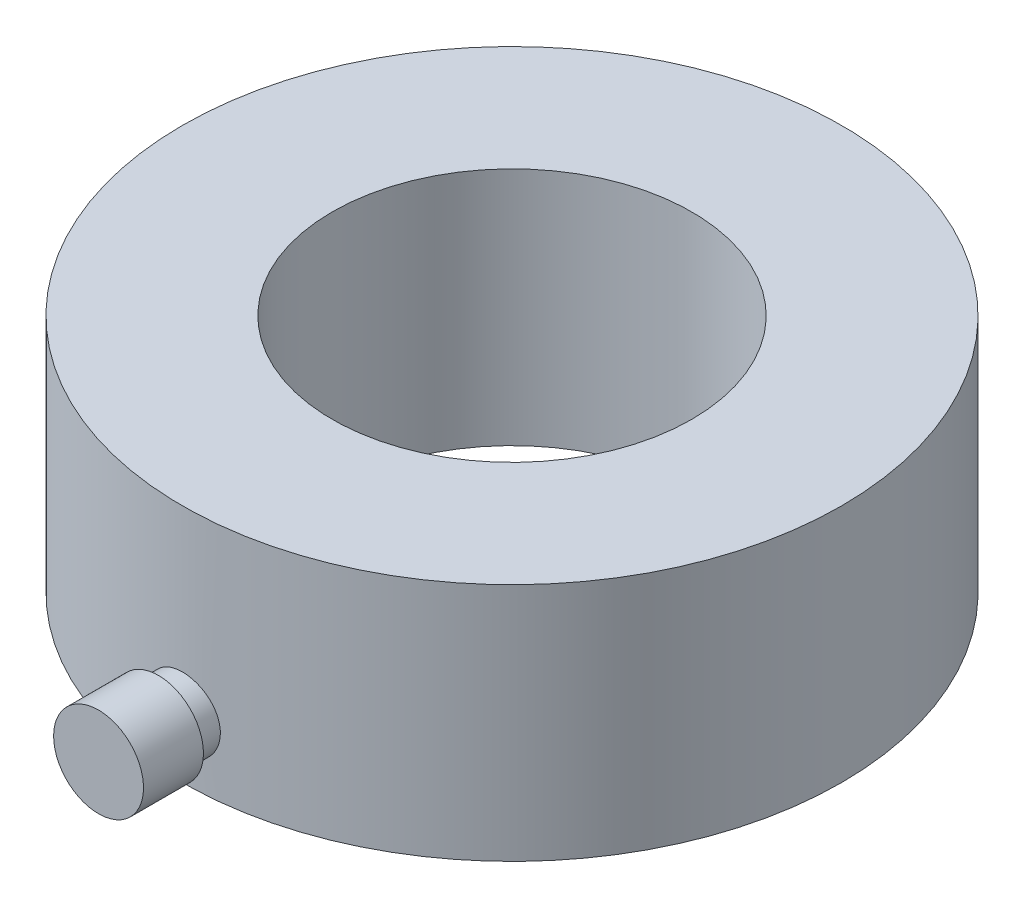
ISO-10303-21;
HEADER;
FILE_DESCRIPTION(('STEP AP214'),'2;1');
FILE_NAME('part.step','',(''),(''),'','','');
FILE_SCHEMA(('AUTOMOTIVE_DESIGN { 1 0 10303 214 1 1 1 1 }'));
ENDSEC;
DATA;
#1=APPLICATION_CONTEXT('core data for automotive mechanical design processes');
#2=APPLICATION_PROTOCOL_DEFINITION('international standard','automotive_design',2000,#1);
#3=PRODUCT_CONTEXT('',#1,'mechanical');
#4=PRODUCT('Part','Part','',(#3));
#5=PRODUCT_RELATED_PRODUCT_CATEGORY('part','',(#4));
#6=PRODUCT_DEFINITION_FORMATION('','',#4);
#7=PRODUCT_DEFINITION_CONTEXT('part definition',#1,'design');
#8=PRODUCT_DEFINITION('design','',#6,#7);
#9=PRODUCT_DEFINITION_SHAPE('','',#8);
#10=(LENGTH_UNIT() NAMED_UNIT(*) SI_UNIT(.MILLI.,.METRE.));
#11=(NAMED_UNIT(*) PLANE_ANGLE_UNIT() SI_UNIT($,.RADIAN.));
#12=(NAMED_UNIT(*) SI_UNIT($,.STERADIAN.) SOLID_ANGLE_UNIT());
#13=UNCERTAINTY_MEASURE_WITH_UNIT(LENGTH_MEASURE(1.E-05),#10,'distance_accuracy_value','');
#14=(GEOMETRIC_REPRESENTATION_CONTEXT(3) GLOBAL_UNCERTAINTY_ASSIGNED_CONTEXT((#13)) GLOBAL_UNIT_ASSIGNED_CONTEXT((#10,
#11,#12)) REPRESENTATION_CONTEXT('',''));
#15=CARTESIAN_POINT('',(0.,0.,0.));
#16=DIRECTION('',(0.,0.,1.));
#17=DIRECTION('',(1.,0.,0.));
#18=AXIS2_PLACEMENT_3D('',#15,#16,#17);
#19=CARTESIAN_POINT('',(0.,0.,0.));
#20=DIRECTION('',(0.,1.,0.));
#21=DIRECTION('',(1.,0.,0.));
#22=AXIS2_PLACEMENT_3D('',#19,#20,#21);
#23=PLANE('',#22);
#24=CARTESIAN_POINT('',(0.,0.,0.));
#25=DIRECTION('',(0.,1.,0.));
#26=DIRECTION('',(1.,0.,0.));
#27=AXIS2_PLACEMENT_3D('',#24,#25,#26);
#28=CIRCLE('',#27,30.);
#29=CARTESIAN_POINT('',(-30.,0.,0.));
#30=VERTEX_POINT('',#29);
#31=EDGE_CURVE('E92',#30,#30,#28,.T.);
#32=ORIENTED_EDGE('',*,*,#31,.T.);
#33=EDGE_LOOP('',(#32));
#34=FACE_BOUND('',#33,.T.);
#35=CARTESIAN_POINT('',(0.,0.,0.));
#36=DIRECTION('',(0.,1.,0.));
#37=DIRECTION('',(-1.,0.,0.));
#38=AXIS2_PLACEMENT_3D('',#35,#36,#37);
#39=CIRCLE('',#38,55.);
#40=CARTESIAN_POINT('',(55.,0.,0.));
#41=VERTEX_POINT('',#40);
#42=EDGE_CURVE('E10',#41,#41,#39,.T.);
#43=ORIENTED_EDGE('',*,*,#42,.F.);
#44=EDGE_LOOP('',(#43));
#45=FACE_BOUND('',#44,.T.);
#46=ADVANCED_FACE('F16',(#34,#45),#23,.F.);
#47=CARTESIAN_POINT('',(0.,40.,0.));
#48=DIRECTION('',(0.,1.,0.));
#49=DIRECTION('',(1.,0.,0.));
#50=AXIS2_PLACEMENT_3D('',#47,#48,#49);
#51=PLANE('',#50);
#52=CARTESIAN_POINT('',(0.,40.,0.));
#53=DIRECTION('',(0.,-1.,0.));
#54=DIRECTION('',(1.,0.,0.));
#55=AXIS2_PLACEMENT_3D('',#52,#53,#54);
#56=CIRCLE('',#55,30.);
#57=CARTESIAN_POINT('',(-30.,40.,0.));
#58=VERTEX_POINT('',#57);
#59=EDGE_CURVE('E102',#58,#58,#56,.T.);
#60=ORIENTED_EDGE('',*,*,#59,.T.);
#61=EDGE_LOOP('',(#60));
#62=FACE_BOUND('',#61,.T.);
#63=CARTESIAN_POINT('',(0.,40.,0.));
#64=DIRECTION('',(0.,1.,0.));
#65=DIRECTION('',(-1.,0.,0.));
#66=AXIS2_PLACEMENT_3D('',#63,#64,#65);
#67=CIRCLE('',#66,55.);
#68=CARTESIAN_POINT('',(55.,40.,0.));
#69=VERTEX_POINT('',#68);
#70=EDGE_CURVE('E120',#69,#69,#67,.T.);
#71=ORIENTED_EDGE('',*,*,#70,.T.);
#72=EDGE_LOOP('',(#71));
#73=FACE_BOUND('',#72,.T.);
#74=ADVANCED_FACE('F106',(#62,#73),#51,.T.);
#75=CARTESIAN_POINT('',(0.,0.,0.));
#76=DIRECTION('',(0.,1.,0.));
#77=DIRECTION('',(-1.,0.,0.));
#78=AXIS2_PLACEMENT_3D('',#75,#76,#77);
#79=CYLINDRICAL_SURFACE('',#78,55.);
#80=CARTESIAN_POINT('',(-5.99999999999996,10.,54.6717477313466));
#81=CARTESIAN_POINT('',(-6.00000768003073,10.0990131681619,54.6717461806716));
#82=CARTESIAN_POINT('',(-5.99764143410403,10.1980314195202,54.6720065439252));
#83=CARTESIAN_POINT('',(-5.98811538831646,10.3951306054946,54.6730511089026));
#84=CARTESIAN_POINT('',(-5.98098965038959,10.4932132124071,54.6738315882569));
#85=CARTESIAN_POINT('',(-5.96194594034771,10.6884423680346,54.6759113905442));
#86=CARTESIAN_POINT('',(-5.95005067743253,10.785591149657,54.6772082546079));
#87=CARTESIAN_POINT('',(-5.9214810328095,10.9789515205911,54.6803097075683));
#88=CARTESIAN_POINT('',(-5.90481749454763,11.0751647298916,54.6821131443086));
#89=CARTESIAN_POINT('',(-5.86672129408108,11.2666549917009,54.6862135071838));
#90=CARTESIAN_POINT('',(-5.84528752224197,11.3619318209993,54.688510548135));
#91=CARTESIAN_POINT('',(-5.79766132837355,11.5515513092226,54.6935800428972));
#92=CARTESIAN_POINT('',(-5.77145609957133,11.6458907154784,54.6963537750126));
#93=CARTESIAN_POINT('',(-5.71429629777718,11.8336387322592,54.7023550468304));
#94=CARTESIAN_POINT('',(-5.68331781618562,11.9270399855855,54.7055848637932));
#95=CARTESIAN_POINT('',(-5.61662066505169,12.1129155591855,54.7124730168264));
#96=CARTESIAN_POINT('',(-5.58086788679792,12.2053775098389,54.7161344117649));
#97=CARTESIAN_POINT('',(-5.50506739187797,12.3883180473515,54.7238127692947));
#98=CARTESIAN_POINT('',(-5.46502733163503,12.4787998334886,54.7278290958635));
#99=CARTESIAN_POINT('',(-5.3808759611663,12.657071266747,54.7361667286298));
#100=CARTESIAN_POINT('',(-5.33679474716211,12.7448752124278,54.7404857315889));
#101=CARTESIAN_POINT('',(-5.24456969219406,12.9177933090811,54.7493983977165));
#102=CARTESIAN_POINT('',(-5.19644534257738,13.0029179205447,54.7539907151686));
#103=CARTESIAN_POINT('',(-5.09614196308206,13.1704816024455,54.7634172461667));
#104=CARTESIAN_POINT('',(-5.04397186998613,13.2529260515467,54.7682509186066));
#105=CARTESIAN_POINT('',(-4.93558490020864,13.4151347135851,54.7781248620207));
#106=CARTESIAN_POINT('',(-4.87936677418759,13.4948980878282,54.7831651965683));
#107=CARTESIAN_POINT('',(-4.76289117723921,13.6517510729785,54.7934146990503));
#108=CARTESIAN_POINT('',(-4.70262294625374,13.728832663515,54.798624296071));
#109=CARTESIAN_POINT('',(-4.57805341509225,13.8803293628848,54.8091721710482));
#110=CARTESIAN_POINT('',(-4.51373278369709,13.9547285330148,54.8145109770354));
#111=CARTESIAN_POINT('',(-4.38106525515576,14.1008686730933,54.825274539342));
#112=CARTESIAN_POINT('',(-4.31269161460873,14.1725853184158,54.8306996402811));
#113=CARTESIAN_POINT('',(-4.17267572344905,14.3126100875014,54.8415326755442));
#114=CARTESIAN_POINT('',(-4.10103683386074,14.380921571113,54.846940621654));
#115=CARTESIAN_POINT('',(-3.95503165371897,14.5134883360189,54.8576616556827));
#116=CARTESIAN_POINT('',(-3.88068871655826,14.5777692826198,54.8629751462433));
#117=CARTESIAN_POINT('',(-3.72928420150497,14.7022817250662,54.873474187268));
#118=CARTESIAN_POINT('',(-3.65223763613632,14.7625314266967,54.8786602349924));
#119=CARTESIAN_POINT('',(-3.4954330771139,14.8789891238928,54.8888704989002));
#120=CARTESIAN_POINT('',(-3.41568224977827,14.9352067337288,54.8938950831255));
#121=CARTESIAN_POINT('',(-3.25347637561135,15.0436091155887,54.9037475292248));
#122=CARTESIAN_POINT('',(-3.17102139582704,15.0957939874932,54.9085753959697));
#123=CARTESIAN_POINT('',(-3.00341383395254,15.1961406895896,54.9179985724111));
#124=CARTESIAN_POINT('',(-2.91825519163191,15.2442924506385,54.9225932893837));
#125=CARTESIAN_POINT('',(-2.74524576662243,15.3365829303699,54.9315134024857));
#126=CARTESIAN_POINT('',(-2.65738393340013,15.3807010608363,54.9358373848684));
#127=CARTESIAN_POINT('',(-2.47897417652329,15.4649358975808,54.9441782038009));
#128=CARTESIAN_POINT('',(-2.38841145908,15.505021478134,54.9481926024838));
#129=CARTESIAN_POINT('',(-2.20544619029946,15.5808466390607,54.9558404076774));
#130=CARTESIAN_POINT('',(-2.11304325501176,15.6165853011825,54.9594737336675));
#131=CARTESIAN_POINT('',(-1.92726443636923,15.6832622162059,54.9663008337318));
#132=CARTESIAN_POINT('',(-1.8339005626954,15.7142335762601,54.9694976200857));
#133=CARTESIAN_POINT('',(-1.64620857288372,15.7713863527619,54.9754378732029));
#134=CARTESIAN_POINT('',(-1.5518875232941,15.7975907345578,54.978183506886));
#135=CARTESIAN_POINT('',(-1.36228784441143,15.8452197677734,54.9832078174622));
#136=CARTESIAN_POINT('',(-1.26701225119376,15.8666563754482,54.9854876612299));
#137=CARTESIAN_POINT('',(-1.07550968457964,15.9047611882132,54.9895667419415));
#138=CARTESIAN_POINT('',(-0.979282785244852,15.9214297615296,54.9913660159983));
#139=CARTESIAN_POINT('',(-0.785882788543224,15.9500103026571,54.9944703019112));
#140=CARTESIAN_POINT('',(-0.688707979694531,15.9619108096912,54.9957741224861));
#141=CARTESIAN_POINT('',(-0.493416085586033,15.9809668328933,54.9978737982688));
#142=CARTESIAN_POINT('',(-0.395296716123971,15.9880991675149,54.9986671711279));
#143=CARTESIAN_POINT('',(-0.198119378376924,15.9976314701039,54.9997321710602));
#144=CARTESIAN_POINT('',(-0.0990597389834734,15.9999969922851,55.0000000001039));
#145=CARTESIAN_POINT('',(0.099024958842525,16.0000030066589,54.9999999998962));
#146=CARTESIAN_POINT('',(0.198050017205152,15.9976451575308,54.9997323586829));
#147=CARTESIAN_POINT('',(0.395168076654777,15.9881252130502,54.9986680514317));
#148=CARTESIAN_POINT('',(0.49326272552776,15.9809971196636,54.9978751299555));
#149=CARTESIAN_POINT('',(0.68851510091086,15.9619485287984,54.9957765113117));
#150=CARTESIAN_POINT('',(0.785675064103203,15.9500507325695,54.994473243792));
#151=CARTESIAN_POINT('',(0.979055314982852,15.9214740866133,54.991370057687));
#152=CARTESIAN_POINT('',(1.07527724079472,15.9048062067519,54.9895712789908));
#153=CARTESIAN_POINT('',(1.26677981722038,15.8667013635454,54.9854930253204));
#154=CARTESIAN_POINT('',(1.36206029485834,15.8452635402128,54.9832134636681));
#155=CARTESIAN_POINT('',(1.55167977115447,15.7976307441709,54.9781893961202));
#156=CARTESIAN_POINT('',(1.64601561189065,15.7714233351656,54.9754436760422));
#157=CARTESIAN_POINT('',(1.83374703954573,15.7142626951285,54.969502784075));
#158=CARTESIAN_POINT('',(1.92713541874127,15.6832860392714,54.966305400546));
#159=CARTESIAN_POINT('',(2.11297382823534,15.6165984651403,54.9594764605252));
#160=CARTESIAN_POINT('',(2.20541170016875,15.5808540245528,54.9558418495004));
#161=CARTESIAN_POINT('',(2.38838181823848,15.5050406637466,54.9481938412854));
#162=CARTESIAN_POINT('',(2.4789157244351,15.4649757146924,54.9441807923526));
#163=CARTESIAN_POINT('',(2.65727579397195,15.3807754934667,54.9358425834793));
#164=CARTESIAN_POINT('',(2.74511655961483,15.3366709488355,54.9315198265962));
#165=CARTESIAN_POINT('',(2.91809256520579,15.2444027933452,54.9226019102534));
#166=CARTESIAN_POINT('',(3.00323862804123,15.1962593471388,54.9180081344673));
#167=CARTESIAN_POINT('',(3.17082957787429,15.095923972531,54.9085864673151));
#168=CARTESIAN_POINT('',(3.25328026967844,15.0437416890095,54.9037591434206));
#169=CARTESIAN_POINT('',(3.41548616392907,14.9353392801052,54.8939072901345));
#170=CARTESIAN_POINT('',(3.49524101996195,14.8791186386741,54.8888827355768));
#171=CARTESIAN_POINT('',(3.65206232609214,14.7626497236805,54.8786719193568));
#172=CARTESIAN_POINT('',(3.72912131364262,14.7023914383843,54.8734852741292));
#173=CARTESIAN_POINT('',(3.88055902558895,14.5778563037298,54.8629843486957));
#174=CARTESIAN_POINT('',(3.95492243099503,14.5135608767208,54.8576695601743));
#175=CARTESIAN_POINT('',(4.10097820646054,14.3809609338695,54.8469450429994));
#176=CARTESIAN_POINT('',(4.1726469259603,14.3126304236857,54.841534903649));
#177=CARTESIAN_POINT('',(4.31267125307643,14.172614146954,54.8307012156117));
#178=CARTESIAN_POINT('',(4.38102584217656,14.1009273620767,54.8252776633343));
#179=CARTESIAN_POINT('',(4.51366016436393,13.9548378486007,54.814516941846));
#180=CARTESIAN_POINT('',(4.57796631202027,13.8804591481556,54.8091794303868));
#181=CARTESIAN_POINT('',(4.70251315379481,13.7289956360134,54.7986337080146));
#182=CARTESIAN_POINT('',(4.76277280725506,13.6519264566797,54.7934249787375));
#183=CARTESIAN_POINT('',(4.87923720348077,13.4950901889697,54.783176734282));
#184=CARTESIAN_POINT('',(4.93545230886361,13.4153308247793,54.7781368057381));
#185=CARTESIAN_POINT('',(5.04383927862025,13.2531221478862,54.7682631324246));
#186=CARTESIAN_POINT('',(5.09601197611138,13.1706733944554,54.7634293452634));
#187=CARTESIAN_POINT('',(5.19632669481373,13.0030930683882,54.7540019828058));
#188=CARTESIAN_POINT('',(5.24445935480259,12.9179558615931,54.7494089741816));
#189=CARTESIAN_POINT('',(5.33670678024902,12.7450043513219,54.7404943195564));
#190=CARTESIAN_POINT('',(5.38080163096913,12.6571793598717,54.7361740481244));
#191=CARTESIAN_POINT('',(5.46498747166955,12.478858208512,54.7278330904967));
#192=CARTESIAN_POINT('',(5.50504796518985,12.3883475579721,54.7238147371546));
#193=CARTESIAN_POINT('',(5.58086745969302,12.2053959367715,54.7161344550333));
#194=CARTESIAN_POINT('',(5.61662108670556,12.1129527200108,54.7124729726111));
#195=CARTESIAN_POINT('',(5.6833189371629,11.9271089417132,54.7055847486881));
#196=CARTESIAN_POINT('',(5.71429708021942,11.8337206836405,54.7023549650132));
#197=CARTESIAN_POINT('',(5.77145672322886,11.6459935948073,54.6963537092035));
#198=CARTESIAN_POINT('',(5.79766190996184,11.5516620535908,54.6935799808724));
#199=CARTESIAN_POINT('',(5.84528816421079,11.3620530676142,54.6885104799199));
#200=CARTESIAN_POINT('',(5.86672180016575,11.266778815172,54.6862134527598));
#201=CARTESIAN_POINT('',(5.90481799517627,11.075288514784,54.6821130903782));
#202=CARTESIAN_POINT('',(5.92148141216724,10.9790726394148,54.6803096663836));
#203=CARTESIAN_POINT('',(5.9500510627549,10.7857017201096,54.6772082127808));
#204=CARTESIAN_POINT('',(5.96194619413948,10.688545017638,54.6759113628288));
#205=CARTESIAN_POINT('',(5.98098990515862,10.4932948004591,54.6738315604313));
#206=CARTESIAN_POINT('',(5.98811551605595,10.395199027651,54.6730510949602));
#207=CARTESIAN_POINT('',(5.99764155647098,10.1980682515646,54.672006530442));
#208=CARTESIAN_POINT('',(6.00000767052161,10.0990315637593,54.6717461814709));
#209=CARTESIAN_POINT('',(6.00000000000001,10.,54.6717477313466));
#210=B_SPLINE_CURVE_WITH_KNOTS('',3,(#80,#81,#82,#83,#84,#85,#86,#87,#88,#89,#90,#91,#92,#93,
#94,#95,#96,#97,#98,#99,#100,#101,#102,#103,#104,#105,#106,#107,#108,#109,#110,#111,#112,#113,
#114,#115,#116,#117,#118,#119,#120,#121,#122,#123,#124,#125,#126,#127,#128,#129,#130,#131,#132,
#133,#134,#135,#136,#137,#138,#139,#140,#141,#142,#143,#144,#145,#146,#147,#148,#149,#150,#151,
#152,#153,#154,#155,#156,#157,#158,#159,#160,#161,#162,#163,#164,#165,#166,#167,#168,#169,#170,
#171,#172,#173,#174,#175,#176,#177,#178,#179,#180,#181,#182,#183,#184,#185,#186,#187,#188,#189,
#190,#191,#192,#193,#194,#195,#196,#197,#198,#199,#200,#201,#202,#203,#204,#205,#206,#207,#208,
#209),.UNSPECIFIED.,.F.,.F.,(4,2,2,2,2,2,2,2,2,2,2,2,2,2,2,2,2,2,2,2,2,2,2,2,2,2,2,2,2,2,2,2,2,
2,2,2,2,2,2,2,2,2,2,2,2,2,2,2,2,2,2,2,2,2,2,2,2,2,2,2,2,2,2,2,4),(0.,0.297017996355574,
0.591932800053095,0.885459787118046,1.17832450364985,1.47125741664702,1.76498848413252,
2.06024174409091,2.35773012012915,2.65469581946393,2.94960614395319,3.24316843040126,
3.5360997807553,3.82912192889252,4.12295593929323,4.41831693015187,4.7159090114246,
5.01320140001682,5.3083530978918,5.60206658749087,5.89505469625693,6.1880355461343,
6.48172731217161,6.77684297919268,7.07408528566145,7.37139027353776,7.66652711127462,
7.96020209981593,8.25313211454347,8.54603950073522,8.83964677067712,9.13467129466645,
9.43182017865985,9.72886473288093,10.0238142118154,10.3173762451804,10.6102685191068,
10.9032136423039,11.1969338334298,11.4921456227271,11.7895547597828,12.0866928284829,
12.3817334819917,12.6753800088752,12.9683457381732,13.2613489714078,13.555107735128,
13.8503345434517,14.1477313592306,14.4452190006518,14.7405048710873,15.0342936010085,
15.3273006225419,15.6202470954725,15.9138546260712,16.2088399696237,16.5059099089063,
16.8033467650577,17.0985625713173,17.3922708238841,17.6851960355796,17.9780685308218,
18.2716190276805,18.5665732053775,18.8636464568334),.UNSPECIFIED.);
#211=CARTESIAN_POINT('',(-6.,10.,54.6717477313466));
#212=VERTEX_POINT('',#211);
#213=CARTESIAN_POINT('',(6.,10.,54.6717477313466));
#214=VERTEX_POINT('',#213);
#215=EDGE_CURVE('E156',#212,#214,#210,.T.);
#216=ORIENTED_EDGE('',*,*,#215,.T.);
#217=CARTESIAN_POINT('',(6.00000000000001,10.,54.6717477313466));
#218=CARTESIAN_POINT('',(6.00000768003079,9.90098683183337,54.6717461806716));
#219=CARTESIAN_POINT('',(5.99764143410412,9.80196858047042,54.6720065439251));
#220=CARTESIAN_POINT('',(5.98811538831654,9.60486939448792,54.6730511089026));
#221=CARTESIAN_POINT('',(5.9809896503897,9.50678678757207,54.6738315882569));
#222=CARTESIAN_POINT('',(5.96194594034781,9.31155763193919,54.6759113905441));
#223=CARTESIAN_POINT('',(5.95005067743268,9.21440885031476,54.6772082546079));
#224=CARTESIAN_POINT('',(5.92148103280966,9.02104847937797,54.6803097075683));
#225=CARTESIAN_POINT('',(5.90481749454782,8.92483527007682,54.6821131443085));
#226=CARTESIAN_POINT('',(5.86672129408127,8.7333450082675,54.6862135071838));
#227=CARTESIAN_POINT('',(5.84528752224219,8.63806817896979,54.688510548135));
#228=CARTESIAN_POINT('',(5.79766132837377,8.44844869074913,54.6935800428971));
#229=CARTESIAN_POINT('',(5.77145609957156,8.35410928449532,54.6963537750126));
#230=CARTESIAN_POINT('',(5.71429629777744,8.16636126771993,54.7023550468303));
#231=CARTESIAN_POINT('',(5.68331781618594,8.07296001439695,54.7055848637931));
#232=CARTESIAN_POINT('',(5.6166206650519,7.88708444080499,54.7124730168263));
#233=CARTESIAN_POINT('',(5.58086788679797,7.79462249015643,54.7161344117649));
#234=CARTESIAN_POINT('',(5.50506739187497,7.61168195264572,54.723812769295));
#235=CARTESIAN_POINT('',(5.46502733162877,7.52120016650594,54.7278290958641));
#236=CARTESIAN_POINT('',(5.3808759611546,7.34292873324291,54.7361667286309));
#237=CARTESIAN_POINT('',(5.33679474714827,7.25512478756012,54.7404857315903));
#238=CARTESIAN_POINT('',(5.24456969217672,7.08220669090375,54.7493983977182));
#239=CARTESIAN_POINT('',(5.1964453425587,6.99708207943891,54.7539907151704));
#240=CARTESIAN_POINT('',(5.09614196306158,6.82951839753658,54.7634172461686));
#241=CARTESIAN_POINT('',(5.04397186996523,6.74707394843498,54.7682509186086));
#242=CARTESIAN_POINT('',(4.93558490018774,6.58486528639654,54.7781248620226));
#243=CARTESIAN_POINT('',(4.87936677416715,6.50510191215382,54.7831651965701));
#244=CARTESIAN_POINT('',(4.76289117722053,6.34824892700507,54.7934146990519));
#245=CARTESIAN_POINT('',(4.70262294623639,6.27116733646982,54.7986242960725));
#246=CARTESIAN_POINT('',(4.57805341507841,6.11967063710308,54.8091721710493));
#247=CARTESIAN_POINT('',(4.51373278368548,6.04527146697508,54.8145109770364));
#248=CARTESIAN_POINT('',(4.38106525514942,5.89913132690129,54.8252745393425));
#249=CARTESIAN_POINT('',(4.31269161460548,5.82741468158155,54.8306996402813));
#250=CARTESIAN_POINT('',(4.17267572344903,5.68738991249825,54.8415326755442));
#251=CARTESIAN_POINT('',(4.10103683386073,5.61907842888637,54.846940621654));
#252=CARTESIAN_POINT('',(3.95503165371901,5.48651166397997,54.8576616556827));
#253=CARTESIAN_POINT('',(3.88068871655832,5.42223071737877,54.8629751462433));
#254=CARTESIAN_POINT('',(3.72928420150507,5.297718274932,54.873474187268));
#255=CARTESIAN_POINT('',(3.65223763613644,5.23746857330137,54.8786602349924));
#256=CARTESIAN_POINT('',(3.49543307711404,5.12101087610511,54.8888704989002));
#257=CARTESIAN_POINT('',(3.41568224977841,5.06479326626911,54.8938950831255));
#258=CARTESIAN_POINT('',(3.25347637561148,4.95639088440916,54.9037475292248));
#259=CARTESIAN_POINT('',(3.17102139582716,4.90420601250467,54.9085753959697));
#260=CARTESIAN_POINT('',(3.00341383395263,4.80385931040852,54.9179985724111));
#261=CARTESIAN_POINT('',(2.91825519163198,4.75570754935967,54.9225932893837));
#262=CARTESIAN_POINT('',(2.74524576662246,4.66341706962872,54.9315134024857));
#263=CARTESIAN_POINT('',(2.65738393340013,4.61929893916254,54.9358373848684));
#264=CARTESIAN_POINT('',(2.47897417652322,4.53506410241854,54.9441782038009));
#265=CARTESIAN_POINT('',(2.38841145907989,4.49497852186561,54.9481926024838));
#266=CARTESIAN_POINT('',(2.20544619030141,4.41915336094051,54.9558404076774));
#267=CARTESIAN_POINT('',(2.11304325501585,4.38341469881997,54.9594737336673));
#268=CARTESIAN_POINT('',(1.92726443637701,4.31673778379863,54.9663008337315));
#269=CARTESIAN_POINT('',(1.8339005627047,4.2857664237453,54.9694976200853));
#270=CARTESIAN_POINT('',(1.64620857289548,4.22861364724493,54.9754378732025));
#271=CARTESIAN_POINT('',(1.55188752330677,4.20240926544961,54.9781835068856));
#272=CARTESIAN_POINT('',(1.36228784442533,4.15478023223463,54.9832078174618));
#273=CARTESIAN_POINT('',(1.26701225120797,4.1333436245601,54.9854876612295));
#274=CARTESIAN_POINT('',(1.07550968459384,4.0952388117951,54.9895667419413));
#275=CARTESIAN_POINT('',(0.979282785258744,4.07857023847849,54.991366015998));
#276=CARTESIAN_POINT('',(0.785882788555897,4.0499896973503,54.994470301911));
#277=CARTESIAN_POINT('',(0.688707979706292,4.03808919031571,54.995774122486));
#278=CARTESIAN_POINT('',(0.493416085595357,4.01903316711224,54.9978737982687));
#279=CARTESIAN_POINT('',(0.395296716131769,4.01190083248984,54.9986671711278));
#280=CARTESIAN_POINT('',(0.198119378381059,4.00236852989859,54.9997321710602));
#281=CARTESIAN_POINT('',(0.0990597389854699,4.0000030077161,55.0000000001039));
#282=CARTESIAN_POINT('',(-0.0990249588374274,3.99999699333992,54.9999999998962));
#283=CARTESIAN_POINT('',(-0.198050017194815,4.00235484246675,54.9997323586829));
#284=CARTESIAN_POINT('',(-0.395168076635449,4.01187478694513,54.9986680514318));
#285=CARTESIAN_POINT('',(-0.493262725504677,4.01900288033092,54.9978751299557));
#286=CARTESIAN_POINT('',(-0.688515100881774,4.03805147119473,54.995776511312));
#287=CARTESIAN_POINT('',(-0.785675064071862,4.04994926742321,54.9944732437925));
#288=CARTESIAN_POINT('',(-0.979055314948515,4.07852591337872,54.9913700576876));
#289=CARTESIAN_POINT('',(-1.07527724075963,4.0951937932399,54.9895712789915));
#290=CARTESIAN_POINT('',(-1.2667798171853,4.13329863644651,54.9854930253212));
#291=CARTESIAN_POINT('',(-1.36206029482399,4.15473645977931,54.983213463669));
#292=CARTESIAN_POINT('',(-1.55167977112312,4.20236925582186,54.9781893961211));
#293=CARTESIAN_POINT('',(-1.64601561186155,4.22857666482769,54.9754436760431));
#294=CARTESIAN_POINT('',(-1.83374703952261,4.28573730486618,54.9695027840758));
#295=CARTESIAN_POINT('',(-1.92713541872188,4.3167139607242,54.9663054005467));
#296=CARTESIAN_POINT('',(-2.11297382822497,4.38340153485734,54.9594764605256));
#297=CARTESIAN_POINT('',(-2.20541170016367,4.41914597544597,54.9558418495006));
#298=CARTESIAN_POINT('',(-2.38838181823785,4.49495933625224,54.9481938412855));
#299=CARTESIAN_POINT('',(-2.47891572443375,4.53502428530504,54.9441807923527));
#300=CARTESIAN_POINT('',(-2.65727579396935,4.6192245065285,54.9358425834794));
#301=CARTESIAN_POINT('',(-2.74511655961167,4.66332905115882,54.9315198265964));
#302=CARTESIAN_POINT('',(-2.91809256520176,4.75559720664769,54.9226019102536));
#303=CARTESIAN_POINT('',(-3.00323862803688,4.80374065285361,54.9180081344675));
#304=CARTESIAN_POINT('',(-3.17082957786952,4.9040760274607,54.9085864673154));
#305=CARTESIAN_POINT('',(-3.25328026967355,4.95625831098199,54.9037591434209));
#306=CARTESIAN_POINT('',(-3.41548616392417,5.06466071988633,54.8939072901348));
#307=CARTESIAN_POINT('',(-3.49524101995715,5.12088136131758,54.8888827355771));
#308=CARTESIAN_POINT('',(-3.65206232608777,5.23735027631193,54.878671919357));
#309=CARTESIAN_POINT('',(-3.72912131363858,5.2976085616086,54.8734852741294));
#310=CARTESIAN_POINT('',(-3.88055902558577,5.42214369626461,54.8629843486959));
#311=CARTESIAN_POINT('',(-3.95492243099239,5.48643912327448,54.8576695601745));
#312=CARTESIAN_POINT('',(-4.10097820645919,5.61903906612791,54.8469450429995));
#313=CARTESIAN_POINT('',(-4.1726469259597,5.68736957631305,54.8415349036491));
#314=CARTESIAN_POINT('',(-4.31267125307655,5.8273858530466,54.8307012156117));
#315=CARTESIAN_POINT('',(-4.38102584217669,5.89907263792445,54.8252776633342));
#316=CARTESIAN_POINT('',(-4.51366016436407,6.04516215140133,54.814516941846));
#317=CARTESIAN_POINT('',(-4.57796631202041,6.11954085184685,54.8091794303868));
#318=CARTESIAN_POINT('',(-4.70251315379497,6.27100436398965,54.7986337080146));
#319=CARTESIAN_POINT('',(-4.76277280725523,6.34807354332361,54.7934249787375));
#320=CARTESIAN_POINT('',(-4.87923720348093,6.50490981103385,54.783176734282));
#321=CARTESIAN_POINT('',(-4.93545230886376,6.58466917522436,54.778136805738));
#322=CARTESIAN_POINT('',(-5.04383927862038,6.74687785211745,54.7682631324246));
#323=CARTESIAN_POINT('',(-5.09601197611149,6.82932660554815,54.7634293452634));
#324=CARTESIAN_POINT('',(-5.19632669481381,6.99690693161513,54.7540019828058));
#325=CARTESIAN_POINT('',(-5.24445935480266,7.08204413840994,54.7494089741816));
#326=CARTESIAN_POINT('',(-5.33670678024904,7.25499564868054,54.7404943195564));
#327=CARTESIAN_POINT('',(-5.38080163096913,7.34282064013033,54.7361740481244));
#328=CARTESIAN_POINT('',(-5.46498747166949,7.52114179148911,54.7278330904967));
#329=CARTESIAN_POINT('',(-5.50504796518977,7.61165244202851,54.7238147371546));
#330=CARTESIAN_POINT('',(-5.58086745969294,7.79460406322798,54.7161344550333));
#331=CARTESIAN_POINT('',(-5.6166210867055,7.88704727998821,54.7124729726111));
#332=CARTESIAN_POINT('',(-5.68331893716286,8.07289105828503,54.7055847486881));
#333=CARTESIAN_POINT('',(-5.71429708021937,8.16627931635729,54.7023549650132));
#334=CARTESIAN_POINT('',(-5.77145672322882,8.35400640518994,54.6963537092035));
#335=CARTESIAN_POINT('',(-5.79766190996179,8.44833794640625,54.6935799808724));
#336=CARTESIAN_POINT('',(-5.84528816421075,8.63794693238262,54.6885104799199));
#337=CARTESIAN_POINT('',(-5.86672180016569,8.73322118482475,54.6862134527598));
#338=CARTESIAN_POINT('',(-5.90481799517622,8.9247114852127,54.6821130903782));
#339=CARTESIAN_POINT('',(-5.92148141216719,9.02092736058203,54.6803096663836));
#340=CARTESIAN_POINT('',(-5.95005106275486,9.21429827988747,54.6772082127808));
#341=CARTESIAN_POINT('',(-5.96194619413944,9.31145498235931,54.6759113628288));
#342=CARTESIAN_POINT('',(-5.98098990515858,9.50670519953872,54.6738315604313));
#343=CARTESIAN_POINT('',(-5.9881155160559,9.60480097234717,54.6730510949602));
#344=CARTESIAN_POINT('',(-5.99764155647092,9.80193174843443,54.672006530442));
#345=CARTESIAN_POINT('',(-6.00000767052155,9.90096843624022,54.6717461814709));
#346=CARTESIAN_POINT('',(-5.99999999999996,10.,54.6717477313466));
#347=B_SPLINE_CURVE_WITH_KNOTS('',3,(#217,#218,#219,#220,#221,#222,#223,#224,#225,#226,#227,
#228,#229,#230,#231,#232,#233,#234,#235,#236,#237,#238,#239,#240,#241,#242,#243,#244,#245,#246,
#247,#248,#249,#250,#251,#252,#253,#254,#255,#256,#257,#258,#259,#260,#261,#262,#263,#264,#265,
#266,#267,#268,#269,#270,#271,#272,#273,#274,#275,#276,#277,#278,#279,#280,#281,#282,#283,#284,
#285,#286,#287,#288,#289,#290,#291,#292,#293,#294,#295,#296,#297,#298,#299,#300,#301,#302,#303,
#304,#305,#306,#307,#308,#309,#310,#311,#312,#313,#314,#315,#316,#317,#318,#319,#320,#321,#322,
#323,#324,#325,#326,#327,#328,#329,#330,#331,#332,#333,#334,#335,#336,#337,#338,#339,#340,#341,
#342,#343,#344,#345,#346),.UNSPECIFIED.,.F.,.F.,(4,2,2,2,2,2,2,2,2,2,2,2,2,2,2,2,2,2,2,2,2,2,2,
2,2,2,2,2,2,2,2,2,2,2,2,2,2,2,2,2,2,2,2,2,2,2,2,2,2,2,2,2,2,2,2,2,2,2,2,2,2,2,2,2,4),(0.,
0.297017996369689,0.591932800077268,0.885459787148222,1.178324503682,1.4712574166772,
1.76498848415687,2.06024174410568,2.35773012013074,2.65469581947686,2.94960614397438,
3.24316843042751,3.53609978078327,3.82912192891877,4.12295593931427,4.41831693016413,
4.71590901142448,5.01320140001727,5.30835309789264,5.60206658749191,5.89505469625804,
6.18803554613537,6.48172731217252,6.77684297919337,7.07408528566188,7.37139027353086,
7.66652711126254,7.96020209980079,8.25313211452732,8.54603950072008,8.8396467706649,
9.13467129465899,9.43182017865892,9.72886473286417,10.0238142117872,10.3173762451453,
10.6102685190694,10.9032136422688,11.1969338334016,11.4921456227104,11.7895547597821,
12.0866928284787,12.3817334819848,12.6753800088666,12.968345738164,13.2613489713992,
13.5551077351211,13.8503345434478,14.147731359231,14.4452190006534,14.7405048710898,
15.0342936010115,15.3273006225451,15.6202470954755,15.9138546260735,16.208839969625,
16.5059099089061,16.8033467650561,17.0985625713148,17.3922708238809,17.6851960355762,
17.9780685308186,18.2716190276779,18.566573205376,18.8636464568333),.UNSPECIFIED.);
#348=EDGE_CURVE('E84',#214,#212,#347,.T.);
#349=ORIENTED_EDGE('',*,*,#348,.T.);
#350=EDGE_LOOP('',(#216,#349));
#351=FACE_BOUND('',#350,.T.);
#352=ORIENTED_EDGE('',*,*,#70,.F.);
#353=DIRECTION('',(0.,-1.,0.));
#354=VECTOR('',#353,1.);
#355=CARTESIAN_POINT('',(55.,0.,0.));
#356=LINE('',#355,#354);
#357=EDGE_CURVE('E29',#69,#41,#356,.T.);
#358=ORIENTED_EDGE('',*,*,#357,.T.);
#359=ORIENTED_EDGE('',*,*,#42,.T.);
#360=ORIENTED_EDGE('',*,*,#357,.F.);
#361=EDGE_LOOP('',(#352,#358,#359,#360));
#362=FACE_BOUND('',#361,.T.);
#363=ADVANCED_FACE('F132',(#351,#362),#79,.T.);
#364=CARTESIAN_POINT('',(0.,10.,59.));
#365=DIRECTION('',(0.,0.,1.));
#366=DIRECTION('',(1.,0.,0.));
#367=AXIS2_PLACEMENT_3D('',#364,#365,#366);
#368=PLANE('',#367);
#369=CARTESIAN_POINT('',(0.,10.,59.));
#370=DIRECTION('',(0.,0.,1.));
#371=DIRECTION('',(-1.,0.,0.));
#372=AXIS2_PLACEMENT_3D('',#369,#370,#371);
#373=CIRCLE('',#372,6.);
#374=CARTESIAN_POINT('',(6.,10.,59.));
#375=VERTEX_POINT('',#374);
#376=EDGE_CURVE('E125',#375,#375,#373,.T.);
#377=ORIENTED_EDGE('',*,*,#376,.T.);
#378=EDGE_LOOP('',(#377));
#379=FACE_BOUND('',#378,.T.);
#380=CARTESIAN_POINT('',(0.,10.,59.));
#381=DIRECTION('',(0.,0.,-1.));
#382=DIRECTION('',(1.,0.,0.));
#383=AXIS2_PLACEMENT_3D('',#380,#381,#382);
#384=CIRCLE('',#383,7.5);
#385=CARTESIAN_POINT('',(-7.5,10.,59.));
#386=VERTEX_POINT('',#385);
#387=EDGE_CURVE('E117',#386,#386,#384,.T.);
#388=ORIENTED_EDGE('',*,*,#387,.T.);
#389=EDGE_LOOP('',(#388));
#390=FACE_BOUND('',#389,.T.);
#391=ADVANCED_FACE('F142',(#379,#390),#368,.F.);
#392=CARTESIAN_POINT('',(0.,10.,69.));
#393=DIRECTION('',(0.,0.,1.));
#394=DIRECTION('',(1.,0.,0.));
#395=AXIS2_PLACEMENT_3D('',#392,#393,#394);
#396=PLANE('',#395);
#397=CARTESIAN_POINT('',(0.,10.,69.));
#398=DIRECTION('',(0.,0.,1.));
#399=DIRECTION('',(1.,0.,0.));
#400=AXIS2_PLACEMENT_3D('',#397,#398,#399);
#401=CIRCLE('',#400,7.5);
#402=CARTESIAN_POINT('',(-7.5,10.,69.));
#403=VERTEX_POINT('',#402);
#404=EDGE_CURVE('E56',#403,#403,#401,.T.);
#405=ORIENTED_EDGE('',*,*,#404,.T.);
#406=EDGE_LOOP('',(#405));
#407=FACE_BOUND('',#406,.T.);
#408=ADVANCED_FACE('F219',(#407),#396,.T.);
#409=CARTESIAN_POINT('',(0.,10.,69.));
#410=DIRECTION('',(0.,0.,-1.));
#411=DIRECTION('',(1.,0.,0.));
#412=AXIS2_PLACEMENT_3D('',#409,#410,#411);
#413=CYLINDRICAL_SURFACE('',#412,7.5);
#414=ORIENTED_EDGE('',*,*,#387,.F.);
#415=DIRECTION('',(0.,0.,1.));
#416=VECTOR('',#415,1.);
#417=CARTESIAN_POINT('',(-7.5,10.,69.));
#418=LINE('',#417,#416);
#419=EDGE_CURVE('E66',#386,#403,#418,.T.);
#420=ORIENTED_EDGE('',*,*,#419,.T.);
#421=ORIENTED_EDGE('',*,*,#404,.F.);
#422=ORIENTED_EDGE('',*,*,#419,.F.);
#423=EDGE_LOOP('',(#414,#420,#421,#422));
#424=FACE_BOUND('',#423,.T.);
#425=ADVANCED_FACE('F214',(#424),#413,.T.);
#426=CARTESIAN_POINT('',(0.,10.,59.));
#427=DIRECTION('',(0.,0.,-1.));
#428=DIRECTION('',(-1.,0.,0.));
#429=AXIS2_PLACEMENT_3D('',#426,#427,#428);
#430=CYLINDRICAL_SURFACE('',#429,6.);
#431=ORIENTED_EDGE('',*,*,#215,.F.);
#432=ORIENTED_EDGE('',*,*,#348,.F.);
#433=DIRECTION('',(0.,0.,1.));
#434=VECTOR('',#433,1.);
#435=CARTESIAN_POINT('',(6.,10.,59.));
#436=LINE('',#435,#434);
#437=EDGE_CURVE('E77',#214,#375,#436,.T.);
#438=ORIENTED_EDGE('',*,*,#437,.T.);
#439=ORIENTED_EDGE('',*,*,#376,.F.);
#440=ORIENTED_EDGE('',*,*,#437,.F.);
#441=EDGE_LOOP('',(#431,#432,#438,#439,#440));
#442=FACE_BOUND('',#441,.T.);
#443=ADVANCED_FACE('F18',(#442),#430,.T.);
#444=CARTESIAN_POINT('',(0.,-130.51686133635,0.));
#445=DIRECTION('',(0.,1.,0.));
#446=DIRECTION('',(1.,0.,0.));
#447=AXIS2_PLACEMENT_3D('',#444,#445,#446);
#448=CYLINDRICAL_SURFACE('',#447,30.);
#449=ORIENTED_EDGE('',*,*,#59,.F.);
#450=DIRECTION('',(0.,-1.,0.));
#451=VECTOR('',#450,1.);
#452=CARTESIAN_POINT('',(-30.,-130.51686133635,0.));
#453=LINE('',#452,#451);
#454=EDGE_CURVE('E99',#58,#30,#453,.T.);
#455=ORIENTED_EDGE('',*,*,#454,.T.);
#456=ORIENTED_EDGE('',*,*,#31,.F.);
#457=ORIENTED_EDGE('',*,*,#454,.F.);
#458=EDGE_LOOP('',(#449,#455,#456,#457));
#459=FACE_BOUND('',#458,.T.);
#460=ADVANCED_FACE('F101',(#459),#448,.F.);
#461=CLOSED_SHELL('',(#46,#74,#363,#391,#408,#425,#443,#460));
#462=MANIFOLD_SOLID_BREP('B1',#461);
#463=ADVANCED_BREP_SHAPE_REPRESENTATION('',(#18,#462),#14);
#464=SHAPE_DEFINITION_REPRESENTATION(#9,#463);
ENDSEC;
END-ISO-10303-21;
